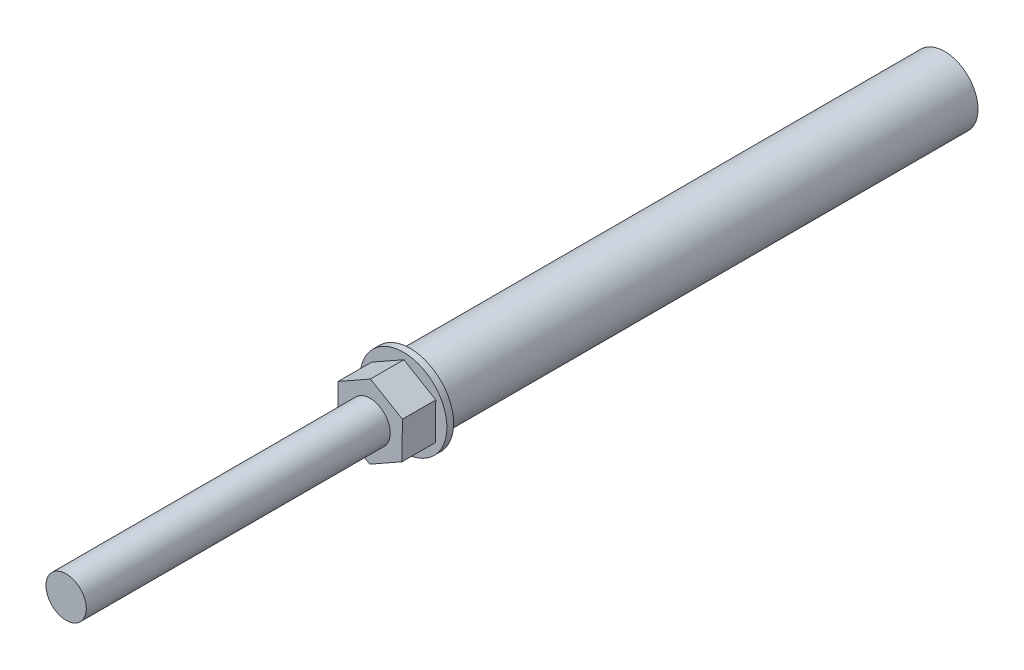
ISO-10303-21;
HEADER;
FILE_DESCRIPTION(('STEP AP214'),'2;1');
FILE_NAME('part.step','',(''),(''),'','','');
FILE_SCHEMA(('AUTOMOTIVE_DESIGN { 1 0 10303 214 1 1 1 1 }'));
ENDSEC;
DATA;
#1=APPLICATION_CONTEXT('core data for automotive mechanical design processes');
#2=APPLICATION_PROTOCOL_DEFINITION('international standard','automotive_design',2000,#1);
#3=PRODUCT_CONTEXT('',#1,'mechanical');
#4=PRODUCT('Part','Part','',(#3));
#5=PRODUCT_RELATED_PRODUCT_CATEGORY('part','',(#4));
#6=PRODUCT_DEFINITION_FORMATION('','',#4);
#7=PRODUCT_DEFINITION_CONTEXT('part definition',#1,'design');
#8=PRODUCT_DEFINITION('design','',#6,#7);
#9=PRODUCT_DEFINITION_SHAPE('','',#8);
#10=(LENGTH_UNIT() NAMED_UNIT(*) SI_UNIT(.MILLI.,.METRE.));
#11=(NAMED_UNIT(*) PLANE_ANGLE_UNIT() SI_UNIT($,.RADIAN.));
#12=(NAMED_UNIT(*) SI_UNIT($,.STERADIAN.) SOLID_ANGLE_UNIT());
#13=UNCERTAINTY_MEASURE_WITH_UNIT(LENGTH_MEASURE(1.E-05),#10,'distance_accuracy_value','');
#14=(GEOMETRIC_REPRESENTATION_CONTEXT(3) GLOBAL_UNCERTAINTY_ASSIGNED_CONTEXT((#13)) GLOBAL_UNIT_ASSIGNED_CONTEXT((#10,
#11,#12)) REPRESENTATION_CONTEXT('',''));
#15=CARTESIAN_POINT('',(0.,0.,0.));
#16=DIRECTION('',(0.,0.,1.));
#17=DIRECTION('',(1.,0.,0.));
#18=AXIS2_PLACEMENT_3D('',#15,#16,#17);
#19=CARTESIAN_POINT('',(0.,0.,80.));
#20=DIRECTION('',(0.,0.,-1.));
#21=DIRECTION('',(-1.,0.,0.));
#22=AXIS2_PLACEMENT_3D('',#19,#20,#21);
#23=CYLINDRICAL_SURFACE('',#22,5.);
#24=CARTESIAN_POINT('',(0.,0.,80.));
#25=DIRECTION('',(0.,0.,1.));
#26=DIRECTION('',(1.,0.,0.));
#27=AXIS2_PLACEMENT_3D('',#24,#25,#26);
#28=CIRCLE('',#27,5.);
#29=CARTESIAN_POINT('',(5.,0.,80.));
#30=VERTEX_POINT('',#29);
#31=EDGE_CURVE('E48',#30,#30,#28,.T.);
#32=ORIENTED_EDGE('',*,*,#31,.F.);
#33=EDGE_LOOP('',(#32));
#34=FACE_BOUND('',#33,.T.);
#35=CARTESIAN_POINT('',(0.,0.,0.));
#36=DIRECTION('',(0.,0.,1.));
#37=DIRECTION('',(1.,0.,0.));
#38=AXIS2_PLACEMENT_3D('',#35,#36,#37);
#39=CIRCLE('',#38,5.);
#40=CARTESIAN_POINT('',(5.,0.,0.));
#41=VERTEX_POINT('',#40);
#42=EDGE_CURVE('E42',#41,#41,#39,.T.);
#43=ORIENTED_EDGE('',*,*,#42,.T.);
#44=EDGE_LOOP('',(#43));
#45=FACE_BOUND('',#44,.T.);
#46=ADVANCED_FACE('F39',(#34,#45),#23,.T.);
#47=CARTESIAN_POINT('',(0.,0.,0.));
#48=DIRECTION('',(0.,0.,1.));
#49=DIRECTION('',(1.,0.,0.));
#50=AXIS2_PLACEMENT_3D('',#47,#48,#49);
#51=PLANE('',#50);
#52=ORIENTED_EDGE('',*,*,#42,.F.);
#53=EDGE_LOOP('',(#52));
#54=FACE_BOUND('',#53,.T.);
#55=ADVANCED_FACE('F139',(#54),#51,.F.);
#56=CARTESIAN_POINT('',(0.,0.,81.));
#57=DIRECTION('',(0.,0.,-1.));
#58=DIRECTION('',(-1.,0.,0.));
#59=AXIS2_PLACEMENT_3D('',#56,#57,#58);
#60=CYLINDRICAL_SURFACE('',#59,6.5);
#61=CARTESIAN_POINT('',(0.,0.,81.));
#62=DIRECTION('',(0.,0.,1.));
#63=DIRECTION('',(1.,0.,0.));
#64=AXIS2_PLACEMENT_3D('',#61,#62,#63);
#65=CIRCLE('',#64,6.5);
#66=CARTESIAN_POINT('',(6.5,0.,81.));
#67=VERTEX_POINT('',#66);
#68=EDGE_CURVE('E122',#67,#67,#65,.T.);
#69=ORIENTED_EDGE('',*,*,#68,.F.);
#70=EDGE_LOOP('',(#69));
#71=FACE_BOUND('',#70,.T.);
#72=CARTESIAN_POINT('',(0.,0.,80.));
#73=DIRECTION('',(0.,0.,1.));
#74=DIRECTION('',(1.,0.,0.));
#75=AXIS2_PLACEMENT_3D('',#72,#73,#74);
#76=CIRCLE('',#75,6.5);
#77=CARTESIAN_POINT('',(6.5,0.,80.));
#78=VERTEX_POINT('',#77);
#79=EDGE_CURVE('E117',#78,#78,#76,.T.);
#80=ORIENTED_EDGE('',*,*,#79,.T.);
#81=EDGE_LOOP('',(#80));
#82=FACE_BOUND('',#81,.T.);
#83=ADVANCED_FACE('F141',(#71,#82),#60,.T.);
#84=CARTESIAN_POINT('',(0.,0.,81.));
#85=DIRECTION('',(0.,0.,1.));
#86=DIRECTION('',(1.,0.,0.));
#87=AXIS2_PLACEMENT_3D('',#84,#85,#86);
#88=PLANE('',#87);
#89=DIRECTION('',(0.870752902483043,0.491720838298883,0.));
#90=VECTOR('',#89,1.);
#91=CARTESIAN_POINT('',(-0.0529019779904913,-5.54868495112976,81.));
#92=LINE('',#91,#90);
#93=CARTESIAN_POINT('',(-0.0529019779904913,-5.54868495112976,81.));
#94=VERTEX_POINT('',#93);
#95=CARTESIAN_POINT('',(4.77885113627954,-2.82015693241509,81.));
#96=VERTEX_POINT('',#95);
#97=EDGE_CURVE('E56',#94,#96,#92,.T.);
#98=ORIENTED_EDGE('',*,*,#97,.F.);
#99=DIRECTION('',(0.861219188778534,-0.508233714819907,0.));
#100=VECTOR('',#99,1.);
#101=CARTESIAN_POINT('',(-4.83175311427003,-2.72852801871466,81.));
#102=LINE('',#101,#100);
#103=CARTESIAN_POINT('',(-4.83175311427003,-2.72852801871466,81.));
#104=VERTEX_POINT('',#103);
#105=EDGE_CURVE('E60',#104,#94,#102,.T.);
#106=ORIENTED_EDGE('',*,*,#105,.F.);
#107=DIRECTION('',(-0.00953371370450832,-0.999954553118791,0.));
#108=VECTOR('',#107,1.);
#109=CARTESIAN_POINT('',(-4.77885113627953,2.82015693241509,81.));
#110=LINE('',#109,#108);
#111=CARTESIAN_POINT('',(-4.77885113627953,2.82015693241509,81.));
#112=VERTEX_POINT('',#111);
#113=EDGE_CURVE('E218',#112,#104,#110,.T.);
#114=ORIENTED_EDGE('',*,*,#113,.F.);
#115=DIRECTION('',(-0.870752902483043,-0.491720838298883,0.));
#116=VECTOR('',#115,1.);
#117=CARTESIAN_POINT('',(0.0529019779904962,5.54868495112976,81.));
#118=LINE('',#117,#116);
#119=CARTESIAN_POINT('',(0.0529019779904962,5.54868495112976,81.));
#120=VERTEX_POINT('',#119);
#121=EDGE_CURVE('E214',#120,#112,#118,.T.);
#122=ORIENTED_EDGE('',*,*,#121,.F.);
#123=DIRECTION('',(-0.861219188778534,0.508233714819908,0.));
#124=VECTOR('',#123,1.);
#125=CARTESIAN_POINT('',(4.83175311427003,2.72852801871466,81.));
#126=LINE('',#125,#124);
#127=CARTESIAN_POINT('',(4.83175311427003,2.72852801871466,81.));
#128=VERTEX_POINT('',#127);
#129=EDGE_CURVE('E210',#128,#120,#126,.T.);
#130=ORIENTED_EDGE('',*,*,#129,.F.);
#131=DIRECTION('',(0.00953371370450816,0.999954553118791,0.));
#132=VECTOR('',#131,1.);
#133=CARTESIAN_POINT('',(4.77885113627954,-2.82015693241509,81.));
#134=LINE('',#133,#132);
#135=EDGE_CURVE('E194',#96,#128,#134,.T.);
#136=ORIENTED_EDGE('',*,*,#135,.F.);
#137=EDGE_LOOP('',(#98,#106,#114,#122,#130,#136));
#138=FACE_BOUND('',#137,.T.);
#139=ORIENTED_EDGE('',*,*,#68,.T.);
#140=EDGE_LOOP('',(#139));
#141=FACE_BOUND('',#140,.T.);
#142=ADVANCED_FACE('F146',(#138,#141),#88,.T.);
#143=CARTESIAN_POINT('',(0.,0.,80.));
#144=DIRECTION('',(0.,0.,1.));
#145=DIRECTION('',(1.,0.,0.));
#146=AXIS2_PLACEMENT_3D('',#143,#144,#145);
#147=PLANE('',#146);
#148=ORIENTED_EDGE('',*,*,#31,.T.);
#149=EDGE_LOOP('',(#148));
#150=FACE_BOUND('',#149,.T.);
#151=ORIENTED_EDGE('',*,*,#79,.F.);
#152=EDGE_LOOP('',(#151));
#153=FACE_BOUND('',#152,.T.);
#154=ADVANCED_FACE('F151',(#150,#153),#147,.F.);
#155=CARTESIAN_POINT('',(-0.0529019779904913,-5.54868495112976,86.));
#156=DIRECTION('',(-0.491720838298883,0.870752902483043,0.));
#157=DIRECTION('',(-0.870752902483043,-0.491720838298883,0.));
#158=AXIS2_PLACEMENT_3D('',#155,#156,#157);
#159=PLANE('',#158);
#160=ORIENTED_EDGE('',*,*,#97,.T.);
#161=DIRECTION('',(0.,0.,-1.));
#162=VECTOR('',#161,1.);
#163=CARTESIAN_POINT('',(4.77885113627954,-2.82015693241509,86.));
#164=LINE('',#163,#162);
#165=CARTESIAN_POINT('',(4.77885113627954,-2.82015693241509,86.));
#166=VERTEX_POINT('',#165);
#167=EDGE_CURVE('E97',#166,#96,#164,.T.);
#168=ORIENTED_EDGE('',*,*,#167,.F.);
#169=DIRECTION('',(0.870752902483043,0.491720838298883,0.));
#170=VECTOR('',#169,1.);
#171=CARTESIAN_POINT('',(-0.0529019779904913,-5.54868495112976,86.));
#172=LINE('',#171,#170);
#173=CARTESIAN_POINT('',(-0.0529019779904913,-5.54868495112976,86.));
#174=VERTEX_POINT('',#173);
#175=EDGE_CURVE('E104',#174,#166,#172,.T.);
#176=ORIENTED_EDGE('',*,*,#175,.F.);
#177=DIRECTION('',(0.,0.,-1.));
#178=VECTOR('',#177,1.);
#179=CARTESIAN_POINT('',(-0.0529019779904913,-5.54868495112976,86.));
#180=LINE('',#179,#178);
#181=EDGE_CURVE('E206',#174,#94,#180,.T.);
#182=ORIENTED_EDGE('',*,*,#181,.T.);
#183=EDGE_LOOP('',(#160,#168,#176,#182));
#184=FACE_BOUND('',#183,.T.);
#185=ADVANCED_FACE('F115',(#184),#159,.F.);
#186=CARTESIAN_POINT('',(4.77885113627954,-2.82015693241509,86.));
#187=DIRECTION('',(-0.999954553118791,0.00953371370450817,0.));
#188=DIRECTION('',(-0.00953371370450817,-0.999954553118791,0.));
#189=AXIS2_PLACEMENT_3D('',#186,#187,#188);
#190=PLANE('',#189);
#191=ORIENTED_EDGE('',*,*,#135,.T.);
#192=DIRECTION('',(0.,0.,-1.));
#193=VECTOR('',#192,1.);
#194=CARTESIAN_POINT('',(4.83175311427003,2.72852801871466,86.));
#195=LINE('',#194,#193);
#196=CARTESIAN_POINT('',(4.83175311427003,2.72852801871466,86.));
#197=VERTEX_POINT('',#196);
#198=EDGE_CURVE('E99',#197,#128,#195,.T.);
#199=ORIENTED_EDGE('',*,*,#198,.F.);
#200=DIRECTION('',(0.00953371370450816,0.999954553118791,0.));
#201=VECTOR('',#200,1.);
#202=CARTESIAN_POINT('',(4.77885113627954,-2.82015693241509,86.));
#203=LINE('',#202,#201);
#204=EDGE_CURVE('E92',#166,#197,#203,.T.);
#205=ORIENTED_EDGE('',*,*,#204,.F.);
#206=ORIENTED_EDGE('',*,*,#167,.T.);
#207=EDGE_LOOP('',(#191,#199,#205,#206));
#208=FACE_BOUND('',#207,.T.);
#209=ADVANCED_FACE('F95',(#208),#190,.F.);
#210=CARTESIAN_POINT('',(4.83175311427003,2.72852801871466,86.));
#211=DIRECTION('',(-0.508233714819908,-0.861219188778535,0.));
#212=DIRECTION('',(0.861219188778535,-0.508233714819908,0.));
#213=AXIS2_PLACEMENT_3D('',#210,#211,#212);
#214=PLANE('',#213);
#215=ORIENTED_EDGE('',*,*,#129,.T.);
#216=DIRECTION('',(0.,0.,-1.));
#217=VECTOR('',#216,1.);
#218=CARTESIAN_POINT('',(0.0529019779904962,5.54868495112976,86.));
#219=LINE('',#218,#217);
#220=CARTESIAN_POINT('',(0.0529019779904962,5.54868495112976,86.));
#221=VERTEX_POINT('',#220);
#222=EDGE_CURVE('E124',#221,#120,#219,.T.);
#223=ORIENTED_EDGE('',*,*,#222,.F.);
#224=DIRECTION('',(-0.861219188778534,0.508233714819908,0.));
#225=VECTOR('',#224,1.);
#226=CARTESIAN_POINT('',(4.83175311427003,2.72852801871466,86.));
#227=LINE('',#226,#225);
#228=EDGE_CURVE('E103',#197,#221,#227,.T.);
#229=ORIENTED_EDGE('',*,*,#228,.F.);
#230=ORIENTED_EDGE('',*,*,#198,.T.);
#231=EDGE_LOOP('',(#215,#223,#229,#230));
#232=FACE_BOUND('',#231,.T.);
#233=ADVANCED_FACE('F160',(#232),#214,.F.);
#234=CARTESIAN_POINT('',(0.0529019779904962,5.54868495112976,86.));
#235=DIRECTION('',(0.491720838298883,-0.870752902483043,0.));
#236=DIRECTION('',(0.870752902483043,0.491720838298883,0.));
#237=AXIS2_PLACEMENT_3D('',#234,#235,#236);
#238=PLANE('',#237);
#239=ORIENTED_EDGE('',*,*,#121,.T.);
#240=DIRECTION('',(0.,0.,-1.));
#241=VECTOR('',#240,1.);
#242=CARTESIAN_POINT('',(-4.77885113627953,2.82015693241509,86.));
#243=LINE('',#242,#241);
#244=CARTESIAN_POINT('',(-4.77885113627953,2.82015693241509,86.));
#245=VERTEX_POINT('',#244);
#246=EDGE_CURVE('E229',#245,#112,#243,.T.);
#247=ORIENTED_EDGE('',*,*,#246,.F.);
#248=DIRECTION('',(-0.870752902483043,-0.491720838298883,0.));
#249=VECTOR('',#248,1.);
#250=CARTESIAN_POINT('',(0.0529019779904962,5.54868495112976,86.));
#251=LINE('',#250,#249);
#252=EDGE_CURVE('E199',#221,#245,#251,.T.);
#253=ORIENTED_EDGE('',*,*,#252,.F.);
#254=ORIENTED_EDGE('',*,*,#222,.T.);
#255=EDGE_LOOP('',(#239,#247,#253,#254));
#256=FACE_BOUND('',#255,.T.);
#257=ADVANCED_FACE('F163',(#256),#238,.F.);
#258=CARTESIAN_POINT('',(-4.77885113627953,2.82015693241509,86.));
#259=DIRECTION('',(0.999954553118791,-0.00953371370450832,0.));
#260=DIRECTION('',(0.00953371370450832,0.999954553118791,0.));
#261=AXIS2_PLACEMENT_3D('',#258,#259,#260);
#262=PLANE('',#261);
#263=ORIENTED_EDGE('',*,*,#113,.T.);
#264=DIRECTION('',(0.,0.,-1.));
#265=VECTOR('',#264,1.);
#266=CARTESIAN_POINT('',(-4.83175311427003,-2.72852801871466,86.));
#267=LINE('',#266,#265);
#268=CARTESIAN_POINT('',(-4.83175311427003,-2.72852801871466,86.));
#269=VERTEX_POINT('',#268);
#270=EDGE_CURVE('E225',#269,#104,#267,.T.);
#271=ORIENTED_EDGE('',*,*,#270,.F.);
#272=DIRECTION('',(-0.00953371370450832,-0.999954553118791,0.));
#273=VECTOR('',#272,1.);
#274=CARTESIAN_POINT('',(-4.77885113627953,2.82015693241509,86.));
#275=LINE('',#274,#273);
#276=EDGE_CURVE('E202',#245,#269,#275,.T.);
#277=ORIENTED_EDGE('',*,*,#276,.F.);
#278=ORIENTED_EDGE('',*,*,#246,.T.);
#279=EDGE_LOOP('',(#263,#271,#277,#278));
#280=FACE_BOUND('',#279,.T.);
#281=ADVANCED_FACE('F167',(#280),#262,.F.);
#282=CARTESIAN_POINT('',(-4.83175311427003,-2.72852801871466,86.));
#283=DIRECTION('',(0.508233714819907,0.861219188778535,0.));
#284=DIRECTION('',(-0.861219188778535,0.508233714819907,0.));
#285=AXIS2_PLACEMENT_3D('',#282,#283,#284);
#286=PLANE('',#285);
#287=ORIENTED_EDGE('',*,*,#105,.T.);
#288=ORIENTED_EDGE('',*,*,#181,.F.);
#289=DIRECTION('',(0.861219188778534,-0.508233714819907,0.));
#290=VECTOR('',#289,1.);
#291=CARTESIAN_POINT('',(-4.83175311427003,-2.72852801871466,86.));
#292=LINE('',#291,#290);
#293=EDGE_CURVE('E109',#269,#174,#292,.T.);
#294=ORIENTED_EDGE('',*,*,#293,.F.);
#295=ORIENTED_EDGE('',*,*,#270,.T.);
#296=EDGE_LOOP('',(#287,#288,#294,#295));
#297=FACE_BOUND('',#296,.T.);
#298=ADVANCED_FACE('F171',(#297),#286,.F.);
#299=CARTESIAN_POINT('',(0.,0.,86.));
#300=DIRECTION('',(0.,0.,1.));
#301=DIRECTION('',(1.,0.,0.));
#302=AXIS2_PLACEMENT_3D('',#299,#300,#301);
#303=PLANE('',#302);
#304=CARTESIAN_POINT('',(0.,0.,86.));
#305=DIRECTION('',(0.,0.,1.));
#306=DIRECTION('',(1.,0.,0.));
#307=AXIS2_PLACEMENT_3D('',#304,#305,#306);
#308=CIRCLE('',#307,3.01965356429047);
#309=CARTESIAN_POINT('',(3.01965356429047,0.,86.));
#310=VERTEX_POINT('',#309);
#311=EDGE_CURVE('E11',#310,#310,#308,.T.);
#312=ORIENTED_EDGE('',*,*,#311,.F.);
#313=EDGE_LOOP('',(#312));
#314=FACE_BOUND('',#313,.T.);
#315=ORIENTED_EDGE('',*,*,#175,.T.);
#316=ORIENTED_EDGE('',*,*,#204,.T.);
#317=ORIENTED_EDGE('',*,*,#228,.T.);
#318=ORIENTED_EDGE('',*,*,#252,.T.);
#319=ORIENTED_EDGE('',*,*,#276,.T.);
#320=ORIENTED_EDGE('',*,*,#293,.T.);
#321=EDGE_LOOP('',(#315,#316,#317,#318,#319,#320));
#322=FACE_BOUND('',#321,.T.);
#323=ADVANCED_FACE('F107',(#314,#322),#303,.T.);
#324=CARTESIAN_POINT('',(0.,0.,131.5));
#325=DIRECTION('',(0.,0.,-1.));
#326=DIRECTION('',(-1.,0.,0.));
#327=AXIS2_PLACEMENT_3D('',#324,#325,#326);
#328=CYLINDRICAL_SURFACE('',#327,3.01965356429047);
#329=CARTESIAN_POINT('',(0.,0.,131.5));
#330=DIRECTION('',(0.,0.,1.));
#331=DIRECTION('',(1.,0.,0.));
#332=AXIS2_PLACEMENT_3D('',#329,#330,#331);
#333=CIRCLE('',#332,3.01965356429047);
#334=CARTESIAN_POINT('',(3.01965356429047,0.,131.5));
#335=VERTEX_POINT('',#334);
#336=EDGE_CURVE('E190',#335,#335,#333,.T.);
#337=ORIENTED_EDGE('',*,*,#336,.F.);
#338=EDGE_LOOP('',(#337));
#339=FACE_BOUND('',#338,.T.);
#340=ORIENTED_EDGE('',*,*,#311,.T.);
#341=EDGE_LOOP('',(#340));
#342=FACE_BOUND('',#341,.T.);
#343=ADVANCED_FACE('F178',(#339,#342),#328,.T.);
#344=CARTESIAN_POINT('',(0.,0.,131.5));
#345=DIRECTION('',(0.,0.,1.));
#346=DIRECTION('',(1.,0.,0.));
#347=AXIS2_PLACEMENT_3D('',#344,#345,#346);
#348=PLANE('',#347);
#349=ORIENTED_EDGE('',*,*,#336,.T.);
#350=EDGE_LOOP('',(#349));
#351=FACE_BOUND('',#350,.T.);
#352=ADVANCED_FACE('F182',(#351),#348,.T.);
#353=CLOSED_SHELL('',(#46,#55,#83,#142,#154,#185,#209,#233,#257,#281,#298,#323,#343,#352));
#354=MANIFOLD_SOLID_BREP('B2',#353);
#355=ADVANCED_BREP_SHAPE_REPRESENTATION('',(#18,#354),#14);
#356=SHAPE_DEFINITION_REPRESENTATION(#9,#355);
ENDSEC;
END-ISO-10303-21;
